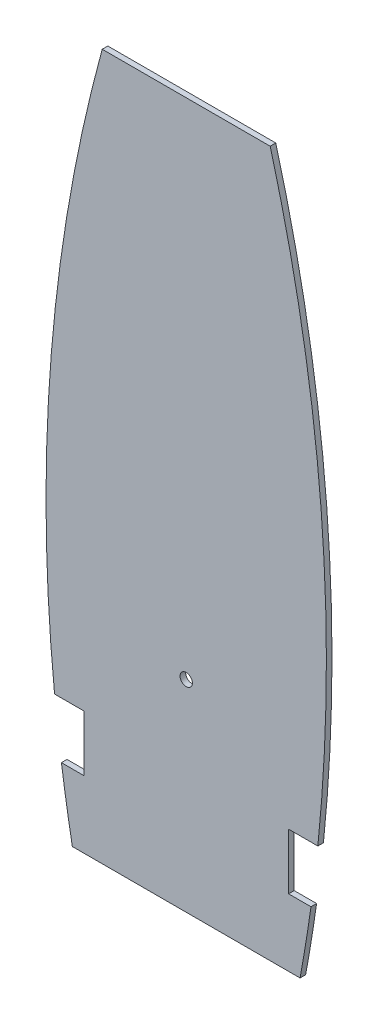
ISO-10303-21;
HEADER;
FILE_DESCRIPTION(('STEP AP214'),'2;1');
FILE_NAME('part.step','',(''),(''),'','','');
FILE_SCHEMA(('AUTOMOTIVE_DESIGN { 1 0 10303 214 1 1 1 1 }'));
ENDSEC;
DATA;
#1=APPLICATION_CONTEXT('core data for automotive mechanical design processes');
#2=APPLICATION_PROTOCOL_DEFINITION('international standard','automotive_design',2000,#1);
#3=PRODUCT_CONTEXT('',#1,'mechanical');
#4=PRODUCT('Part','Part','',(#3));
#5=PRODUCT_RELATED_PRODUCT_CATEGORY('part','',(#4));
#6=PRODUCT_DEFINITION_FORMATION('','',#4);
#7=PRODUCT_DEFINITION_CONTEXT('part definition',#1,'design');
#8=PRODUCT_DEFINITION('design','',#6,#7);
#9=PRODUCT_DEFINITION_SHAPE('','',#8);
#10=(LENGTH_UNIT() NAMED_UNIT(*) SI_UNIT(.MILLI.,.METRE.));
#11=(NAMED_UNIT(*) PLANE_ANGLE_UNIT() SI_UNIT($,.RADIAN.));
#12=(NAMED_UNIT(*) SI_UNIT($,.STERADIAN.) SOLID_ANGLE_UNIT());
#13=UNCERTAINTY_MEASURE_WITH_UNIT(LENGTH_MEASURE(1.E-05),#10,'distance_accuracy_value','');
#14=(GEOMETRIC_REPRESENTATION_CONTEXT(3) GLOBAL_UNCERTAINTY_ASSIGNED_CONTEXT((#13)) GLOBAL_UNIT_ASSIGNED_CONTEXT((#10,
#11,#12)) REPRESENTATION_CONTEXT('',''));
#15=CARTESIAN_POINT('',(0.,0.,0.));
#16=DIRECTION('',(0.,0.,1.));
#17=DIRECTION('',(1.,0.,0.));
#18=AXIS2_PLACEMENT_3D('',#15,#16,#17);
#19=CARTESIAN_POINT('',(-1287.92539340169,-373.27505620024,5.));
#20=DIRECTION('',(0.,0.,-1.));
#21=DIRECTION('',(-1.,0.,0.));
#22=AXIS2_PLACEMENT_3D('',#19,#20,#21);
#23=CYLINDRICAL_SURFACE('',#22,1413.11708487317);
#24=CARTESIAN_POINT('',(-1287.92539340169,-373.27505620024,5.));
#25=DIRECTION('',(0.,0.,1.));
#26=DIRECTION('',(-1.,0.,0.));
#27=AXIS2_PLACEMENT_3D('',#24,#25,#26);
#28=CIRCLE('',#27,1413.11708487317);
#29=CARTESIAN_POINT('',(117.553772728993,-520.,5.));
#30=VERTEX_POINT('',#29);
#31=CARTESIAN_POINT('',(75.,0.,5.));
#32=VERTEX_POINT('',#31);
#33=EDGE_CURVE('E157',#30,#32,#28,.T.);
#34=ORIENTED_EDGE('',*,*,#33,.F.);
#35=DIRECTION('',(0.,0.,-1.));
#36=VECTOR('',#35,1.);
#37=CARTESIAN_POINT('',(117.553772728993,-520.,5.));
#38=LINE('',#37,#36);
#39=CARTESIAN_POINT('',(117.553772728993,-520.,0.));
#40=VERTEX_POINT('',#39);
#41=EDGE_CURVE('E203',#30,#40,#38,.T.);
#42=ORIENTED_EDGE('',*,*,#41,.T.);
#43=CARTESIAN_POINT('',(-1287.92539340169,-373.27505620024,0.));
#44=DIRECTION('',(0.,0.,1.));
#45=DIRECTION('',(-1.,0.,0.));
#46=AXIS2_PLACEMENT_3D('',#43,#44,#45);
#47=CIRCLE('',#46,1413.11708487317);
#48=CARTESIAN_POINT('',(75.,0.,0.));
#49=VERTEX_POINT('',#48);
#50=EDGE_CURVE('E150',#40,#49,#47,.T.);
#51=ORIENTED_EDGE('',*,*,#50,.T.);
#52=DIRECTION('',(0.,0.,-1.));
#53=VECTOR('',#52,1.);
#54=CARTESIAN_POINT('',(75.,0.,5.));
#55=LINE('',#54,#53);
#56=EDGE_CURVE('E11',#32,#49,#55,.T.);
#57=ORIENTED_EDGE('',*,*,#56,.F.);
#58=EDGE_LOOP('',(#34,#42,#51,#57));
#59=FACE_BOUND('',#58,.T.);
#60=ADVANCED_FACE('F32',(#59),#23,.T.);
#61=CARTESIAN_POINT('',(1287.92539340169,-373.27505620024,5.));
#62=DIRECTION('',(0.,0.,-1.));
#63=DIRECTION('',(-1.,0.,0.));
#64=AXIS2_PLACEMENT_3D('',#61,#62,#63);
#65=CYLINDRICAL_SURFACE('',#64,1413.11708487317);
#66=CARTESIAN_POINT('',(1287.92539340169,-373.27505620024,0.));
#67=DIRECTION('',(0.,0.,1.));
#68=DIRECTION('',(1.,0.,0.));
#69=AXIS2_PLACEMENT_3D('',#66,#67,#68);
#70=CIRCLE('',#69,1413.11708487317);
#71=CARTESIAN_POINT('',(-111.431313105777,-570.,0.));
#72=VERTEX_POINT('',#71);
#73=CARTESIAN_POINT('',(-101.676059818425,-630.,0.));
#74=VERTEX_POINT('',#73);
#75=EDGE_CURVE('E156',#72,#74,#70,.T.);
#76=ORIENTED_EDGE('',*,*,#75,.T.);
#77=DIRECTION('',(0.,0.,-1.));
#78=VECTOR('',#77,1.);
#79=CARTESIAN_POINT('',(-101.676059818425,-630.,5.));
#80=LINE('',#79,#78);
#81=CARTESIAN_POINT('',(-101.676059818425,-630.,5.));
#82=VERTEX_POINT('',#81);
#83=EDGE_CURVE('E47',#82,#74,#80,.T.);
#84=ORIENTED_EDGE('',*,*,#83,.F.);
#85=CARTESIAN_POINT('',(1287.92539340169,-373.27505620024,5.));
#86=DIRECTION('',(0.,0.,1.));
#87=DIRECTION('',(1.,0.,0.));
#88=AXIS2_PLACEMENT_3D('',#85,#86,#87);
#89=CIRCLE('',#88,1413.11708487317);
#90=CARTESIAN_POINT('',(-111.431313105777,-570.,5.));
#91=VERTEX_POINT('',#90);
#92=EDGE_CURVE('E145',#91,#82,#89,.T.);
#93=ORIENTED_EDGE('',*,*,#92,.F.);
#94=DIRECTION('',(0.,0.,-1.));
#95=VECTOR('',#94,1.);
#96=CARTESIAN_POINT('',(-111.431313105777,-570.,5.));
#97=LINE('',#96,#95);
#98=EDGE_CURVE('E165',#91,#72,#97,.T.);
#99=ORIENTED_EDGE('',*,*,#98,.T.);
#100=EDGE_LOOP('',(#76,#84,#93,#99));
#101=FACE_BOUND('',#100,.T.);
#102=ADVANCED_FACE('F163',(#101),#65,.T.);
#103=CARTESIAN_POINT('',(101.676059818425,-630.,5.));
#104=VERTEX_POINT('',#103);
#105=CARTESIAN_POINT('',(111.431313105777,-570.,5.));
#106=VERTEX_POINT('',#105);
#107=EDGE_CURVE('E158',#104,#106,#28,.T.);
#108=ORIENTED_EDGE('',*,*,#107,.F.);
#109=DIRECTION('',(0.,0.,-1.));
#110=VECTOR('',#109,1.);
#111=CARTESIAN_POINT('',(101.676059818425,-630.,5.));
#112=LINE('',#111,#110);
#113=CARTESIAN_POINT('',(101.676059818425,-630.,0.));
#114=VERTEX_POINT('',#113);
#115=EDGE_CURVE('E181',#104,#114,#112,.T.);
#116=ORIENTED_EDGE('',*,*,#115,.T.);
#117=CARTESIAN_POINT('',(111.431313105777,-570.,0.));
#118=VERTEX_POINT('',#117);
#119=EDGE_CURVE('E152',#114,#118,#47,.T.);
#120=ORIENTED_EDGE('',*,*,#119,.T.);
#121=DIRECTION('',(0.,0.,-1.));
#122=VECTOR('',#121,1.);
#123=CARTESIAN_POINT('',(111.431313105777,-570.,5.));
#124=LINE('',#123,#122);
#125=EDGE_CURVE('E195',#106,#118,#124,.T.);
#126=ORIENTED_EDGE('',*,*,#125,.F.);
#127=EDGE_LOOP('',(#108,#116,#120,#126));
#128=FACE_BOUND('',#127,.T.);
#129=ADVANCED_FACE('F34',(#128),#23,.T.);
#130=CARTESIAN_POINT('',(-75.,0.,5.));
#131=DIRECTION('',(0.,-1.,0.));
#132=DIRECTION('',(1.,0.,0.));
#133=AXIS2_PLACEMENT_3D('',#130,#131,#132);
#134=PLANE('',#133);
#135=DIRECTION('',(-1.,0.,0.));
#136=VECTOR('',#135,1.);
#137=CARTESIAN_POINT('',(-75.,0.,0.));
#138=LINE('',#137,#136);
#139=CARTESIAN_POINT('',(-75.,0.,0.));
#140=VERTEX_POINT('',#139);
#141=EDGE_CURVE('E154',#49,#140,#138,.T.);
#142=ORIENTED_EDGE('',*,*,#141,.T.);
#143=DIRECTION('',(0.,0.,-1.));
#144=VECTOR('',#143,1.);
#145=CARTESIAN_POINT('',(-75.,0.,5.));
#146=LINE('',#145,#144);
#147=CARTESIAN_POINT('',(-75.,0.,5.));
#148=VERTEX_POINT('',#147);
#149=EDGE_CURVE('E40',#148,#140,#146,.T.);
#150=ORIENTED_EDGE('',*,*,#149,.F.);
#151=DIRECTION('',(-1.,0.,0.));
#152=VECTOR('',#151,1.);
#153=CARTESIAN_POINT('',(-75.,0.,5.));
#154=LINE('',#153,#152);
#155=EDGE_CURVE('E143',#32,#148,#154,.T.);
#156=ORIENTED_EDGE('',*,*,#155,.F.);
#157=ORIENTED_EDGE('',*,*,#56,.T.);
#158=EDGE_LOOP('',(#142,#150,#156,#157));
#159=FACE_BOUND('',#158,.T.);
#160=ADVANCED_FACE('F239',(#159),#134,.F.);
#161=CARTESIAN_POINT('',(-117.553772728993,-520.,0.));
#162=VERTEX_POINT('',#161);
#163=EDGE_CURVE('E137',#140,#162,#70,.T.);
#164=ORIENTED_EDGE('',*,*,#163,.T.);
#165=DIRECTION('',(0.,0.,-1.));
#166=VECTOR('',#165,1.);
#167=CARTESIAN_POINT('',(-117.553772728993,-520.,5.));
#168=LINE('',#167,#166);
#169=CARTESIAN_POINT('',(-117.553772728993,-520.,5.));
#170=VERTEX_POINT('',#169);
#171=EDGE_CURVE('E55',#170,#162,#168,.T.);
#172=ORIENTED_EDGE('',*,*,#171,.F.);
#173=EDGE_CURVE('E135',#148,#170,#89,.T.);
#174=ORIENTED_EDGE('',*,*,#173,.F.);
#175=ORIENTED_EDGE('',*,*,#149,.T.);
#176=EDGE_LOOP('',(#164,#172,#174,#175));
#177=FACE_BOUND('',#176,.T.);
#178=ADVANCED_FACE('F133',(#177),#65,.T.);
#179=CARTESIAN_POINT('',(-1287.92539340169,-373.27505620024,5.));
#180=DIRECTION('',(0.,0.,-1.));
#181=DIRECTION('',(-1.,0.,0.));
#182=AXIS2_PLACEMENT_3D('',#179,#180,#181);
#183=PLANE('',#182);
#184=CARTESIAN_POINT('',(0.,-450.,5.));
#185=DIRECTION('',(0.,0.,-1.));
#186=DIRECTION('',(-1.,0.,0.));
#187=AXIS2_PLACEMENT_3D('',#184,#185,#186);
#188=CIRCLE('',#187,5.5);
#189=CARTESIAN_POINT('',(-5.5,-450.,5.));
#190=VERTEX_POINT('',#189);
#191=EDGE_CURVE('E153',#190,#190,#188,.T.);
#192=ORIENTED_EDGE('',*,*,#191,.T.);
#193=EDGE_LOOP('',(#192));
#194=FACE_BOUND('',#193,.T.);
#195=ORIENTED_EDGE('',*,*,#92,.T.);
#196=DIRECTION('',(1.,0.,0.));
#197=VECTOR('',#196,1.);
#198=CARTESIAN_POINT('',(-101.676059818425,-630.,5.));
#199=LINE('',#198,#197);
#200=EDGE_CURVE('E176',#82,#104,#199,.T.);
#201=ORIENTED_EDGE('',*,*,#200,.T.);
#202=ORIENTED_EDGE('',*,*,#107,.T.);
#203=DIRECTION('',(-1.,0.,0.));
#204=VECTOR('',#203,1.);
#205=CARTESIAN_POINT('',(91.4313131057769,-570.,5.));
#206=LINE('',#205,#204);
#207=CARTESIAN_POINT('',(91.4313131057769,-570.,5.));
#208=VERTEX_POINT('',#207);
#209=EDGE_CURVE('E185',#106,#208,#206,.T.);
#210=ORIENTED_EDGE('',*,*,#209,.T.);
#211=DIRECTION('',(0.,1.,0.));
#212=VECTOR('',#211,1.);
#213=CARTESIAN_POINT('',(91.4313131057769,-520.,5.));
#214=LINE('',#213,#212);
#215=CARTESIAN_POINT('',(91.4313131057769,-520.,5.));
#216=VERTEX_POINT('',#215);
#217=EDGE_CURVE('E188',#208,#216,#214,.T.);
#218=ORIENTED_EDGE('',*,*,#217,.T.);
#219=DIRECTION('',(1.,0.,0.));
#220=VECTOR('',#219,1.);
#221=CARTESIAN_POINT('',(117.553772728993,-520.,5.));
#222=LINE('',#221,#220);
#223=EDGE_CURVE('E192',#216,#30,#222,.T.);
#224=ORIENTED_EDGE('',*,*,#223,.T.);
#225=ORIENTED_EDGE('',*,*,#33,.T.);
#226=ORIENTED_EDGE('',*,*,#155,.T.);
#227=ORIENTED_EDGE('',*,*,#173,.T.);
#228=DIRECTION('',(1.,0.,0.));
#229=VECTOR('',#228,1.);
#230=CARTESIAN_POINT('',(-117.553772728993,-520.,5.));
#231=LINE('',#230,#229);
#232=CARTESIAN_POINT('',(-91.4313131057769,-520.,5.));
#233=VERTEX_POINT('',#232);
#234=EDGE_CURVE('E120',#170,#233,#231,.T.);
#235=ORIENTED_EDGE('',*,*,#234,.T.);
#236=DIRECTION('',(0.,-1.,0.));
#237=VECTOR('',#236,1.);
#238=CARTESIAN_POINT('',(-91.4313131057769,-520.,5.));
#239=LINE('',#238,#237);
#240=CARTESIAN_POINT('',(-91.4313131057769,-570.,5.));
#241=VERTEX_POINT('',#240);
#242=EDGE_CURVE('E127',#233,#241,#239,.T.);
#243=ORIENTED_EDGE('',*,*,#242,.T.);
#244=DIRECTION('',(-1.,0.,0.));
#245=VECTOR('',#244,1.);
#246=CARTESIAN_POINT('',(-91.4313131057769,-570.,5.));
#247=LINE('',#246,#245);
#248=EDGE_CURVE('E138',#241,#91,#247,.T.);
#249=ORIENTED_EDGE('',*,*,#248,.T.);
#250=EDGE_LOOP('',(#195,#201,#202,#210,#218,#224,#225,#226,#227,#235,#243,#249));
#251=FACE_BOUND('',#250,.T.);
#252=ADVANCED_FACE('F141',(#194,#251),#183,.F.);
#253=CARTESIAN_POINT('',(-1287.92539340169,-373.27505620024,0.));
#254=DIRECTION('',(0.,0.,-1.));
#255=DIRECTION('',(-1.,0.,0.));
#256=AXIS2_PLACEMENT_3D('',#253,#254,#255);
#257=PLANE('',#256);
#258=DIRECTION('',(1.,0.,0.));
#259=VECTOR('',#258,1.);
#260=CARTESIAN_POINT('',(-101.676059818425,-630.,0.));
#261=LINE('',#260,#259);
#262=EDGE_CURVE('E172',#74,#114,#261,.T.);
#263=ORIENTED_EDGE('',*,*,#262,.F.);
#264=ORIENTED_EDGE('',*,*,#75,.F.);
#265=DIRECTION('',(-1.,0.,0.));
#266=VECTOR('',#265,1.);
#267=CARTESIAN_POINT('',(-91.4313131057769,-570.,0.));
#268=LINE('',#267,#266);
#269=CARTESIAN_POINT('',(-91.4313131057769,-570.,0.));
#270=VERTEX_POINT('',#269);
#271=EDGE_CURVE('E128',#270,#72,#268,.T.);
#272=ORIENTED_EDGE('',*,*,#271,.F.);
#273=DIRECTION('',(0.,-1.,0.));
#274=VECTOR('',#273,1.);
#275=CARTESIAN_POINT('',(-91.4313131057769,-520.,0.));
#276=LINE('',#275,#274);
#277=CARTESIAN_POINT('',(-91.4313131057769,-520.,0.));
#278=VERTEX_POINT('',#277);
#279=EDGE_CURVE('E284',#278,#270,#276,.T.);
#280=ORIENTED_EDGE('',*,*,#279,.F.);
#281=DIRECTION('',(1.,0.,0.));
#282=VECTOR('',#281,1.);
#283=CARTESIAN_POINT('',(-117.553772728993,-520.,0.));
#284=LINE('',#283,#282);
#285=EDGE_CURVE('E183',#162,#278,#284,.T.);
#286=ORIENTED_EDGE('',*,*,#285,.F.);
#287=ORIENTED_EDGE('',*,*,#163,.F.);
#288=ORIENTED_EDGE('',*,*,#141,.F.);
#289=ORIENTED_EDGE('',*,*,#50,.F.);
#290=DIRECTION('',(1.,0.,0.));
#291=VECTOR('',#290,1.);
#292=CARTESIAN_POINT('',(117.553772728993,-520.,0.));
#293=LINE('',#292,#291);
#294=CARTESIAN_POINT('',(91.4313131057769,-520.,0.));
#295=VERTEX_POINT('',#294);
#296=EDGE_CURVE('E189',#295,#40,#293,.T.);
#297=ORIENTED_EDGE('',*,*,#296,.F.);
#298=DIRECTION('',(0.,1.,0.));
#299=VECTOR('',#298,1.);
#300=CARTESIAN_POINT('',(91.4313131057769,-520.,0.));
#301=LINE('',#300,#299);
#302=CARTESIAN_POINT('',(91.4313131057769,-570.,0.));
#303=VERTEX_POINT('',#302);
#304=EDGE_CURVE('E199',#303,#295,#301,.T.);
#305=ORIENTED_EDGE('',*,*,#304,.F.);
#306=DIRECTION('',(-1.,0.,0.));
#307=VECTOR('',#306,1.);
#308=CARTESIAN_POINT('',(91.4313131057769,-570.,0.));
#309=LINE('',#308,#307);
#310=EDGE_CURVE('E196',#118,#303,#309,.T.);
#311=ORIENTED_EDGE('',*,*,#310,.F.);
#312=ORIENTED_EDGE('',*,*,#119,.F.);
#313=EDGE_LOOP('',(#263,#264,#272,#280,#286,#287,#288,#289,#297,#305,#311,#312));
#314=FACE_BOUND('',#313,.T.);
#315=CARTESIAN_POINT('',(0.,-450.,0.));
#316=DIRECTION('',(0.,0.,-1.));
#317=DIRECTION('',(-1.,0.,0.));
#318=AXIS2_PLACEMENT_3D('',#315,#316,#317);
#319=CIRCLE('',#318,5.5);
#320=CARTESIAN_POINT('',(-5.5,-450.,0.));
#321=VERTEX_POINT('',#320);
#322=EDGE_CURVE('E206',#321,#321,#319,.T.);
#323=ORIENTED_EDGE('',*,*,#322,.F.);
#324=EDGE_LOOP('',(#323));
#325=FACE_BOUND('',#324,.T.);
#326=ADVANCED_FACE('F168',(#314,#325),#257,.T.);
#327=CARTESIAN_POINT('',(0.,-450.,5.));
#328=DIRECTION('',(0.,0.,-1.));
#329=DIRECTION('',(-1.,0.,0.));
#330=AXIS2_PLACEMENT_3D('',#327,#328,#329);
#331=CYLINDRICAL_SURFACE('',#330,5.5);
#332=ORIENTED_EDGE('',*,*,#191,.F.);
#333=EDGE_LOOP('',(#332));
#334=FACE_BOUND('',#333,.T.);
#335=ORIENTED_EDGE('',*,*,#322,.T.);
#336=EDGE_LOOP('',(#335));
#337=FACE_BOUND('',#336,.T.);
#338=ADVANCED_FACE('F217',(#334,#337),#331,.F.);
#339=CARTESIAN_POINT('',(117.553772728993,-520.,5.));
#340=DIRECTION('',(0.,1.,0.));
#341=DIRECTION('',(-1.,0.,0.));
#342=AXIS2_PLACEMENT_3D('',#339,#340,#341);
#343=PLANE('',#342);
#344=ORIENTED_EDGE('',*,*,#296,.T.);
#345=ORIENTED_EDGE('',*,*,#41,.F.);
#346=ORIENTED_EDGE('',*,*,#223,.F.);
#347=DIRECTION('',(0.,0.,-1.));
#348=VECTOR('',#347,1.);
#349=CARTESIAN_POINT('',(91.4313131057769,-520.,5.));
#350=LINE('',#349,#348);
#351=EDGE_CURVE('E207',#216,#295,#350,.T.);
#352=ORIENTED_EDGE('',*,*,#351,.T.);
#353=EDGE_LOOP('',(#344,#345,#346,#352));
#354=FACE_BOUND('',#353,.T.);
#355=ADVANCED_FACE('F225',(#354),#343,.F.);
#356=CARTESIAN_POINT('',(91.4313131057769,-520.,5.));
#357=DIRECTION('',(-1.,0.,0.));
#358=DIRECTION('',(0.,0.,1.));
#359=AXIS2_PLACEMENT_3D('',#356,#357,#358);
#360=PLANE('',#359);
#361=ORIENTED_EDGE('',*,*,#304,.T.);
#362=ORIENTED_EDGE('',*,*,#351,.F.);
#363=ORIENTED_EDGE('',*,*,#217,.F.);
#364=DIRECTION('',(0.,0.,-1.));
#365=VECTOR('',#364,1.);
#366=CARTESIAN_POINT('',(91.4313131057769,-570.,5.));
#367=LINE('',#366,#365);
#368=EDGE_CURVE('E209',#208,#303,#367,.T.);
#369=ORIENTED_EDGE('',*,*,#368,.T.);
#370=EDGE_LOOP('',(#361,#362,#363,#369));
#371=FACE_BOUND('',#370,.T.);
#372=ADVANCED_FACE('F262',(#371),#360,.F.);
#373=CARTESIAN_POINT('',(91.4313131057769,-570.,5.));
#374=DIRECTION('',(0.,-1.,0.));
#375=DIRECTION('',(0.,0.,-1.));
#376=AXIS2_PLACEMENT_3D('',#373,#374,#375);
#377=PLANE('',#376);
#378=ORIENTED_EDGE('',*,*,#310,.T.);
#379=ORIENTED_EDGE('',*,*,#368,.F.);
#380=ORIENTED_EDGE('',*,*,#209,.F.);
#381=ORIENTED_EDGE('',*,*,#125,.T.);
#382=EDGE_LOOP('',(#378,#379,#380,#381));
#383=FACE_BOUND('',#382,.T.);
#384=ADVANCED_FACE('F266',(#383),#377,.F.);
#385=CARTESIAN_POINT('',(-91.4313131057769,-570.,5.));
#386=DIRECTION('',(0.,-1.,0.));
#387=DIRECTION('',(0.,0.,-1.));
#388=AXIS2_PLACEMENT_3D('',#385,#386,#387);
#389=PLANE('',#388);
#390=ORIENTED_EDGE('',*,*,#271,.T.);
#391=ORIENTED_EDGE('',*,*,#98,.F.);
#392=ORIENTED_EDGE('',*,*,#248,.F.);
#393=DIRECTION('',(0.,0.,-1.));
#394=VECTOR('',#393,1.);
#395=CARTESIAN_POINT('',(-91.4313131057769,-570.,5.));
#396=LINE('',#395,#394);
#397=EDGE_CURVE('E292',#241,#270,#396,.T.);
#398=ORIENTED_EDGE('',*,*,#397,.T.);
#399=EDGE_LOOP('',(#390,#391,#392,#398));
#400=FACE_BOUND('',#399,.T.);
#401=ADVANCED_FACE('F269',(#400),#389,.F.);
#402=CARTESIAN_POINT('',(-91.4313131057769,-520.,5.));
#403=DIRECTION('',(1.,0.,0.));
#404=DIRECTION('',(0.,0.,-1.));
#405=AXIS2_PLACEMENT_3D('',#402,#403,#404);
#406=PLANE('',#405);
#407=ORIENTED_EDGE('',*,*,#279,.T.);
#408=ORIENTED_EDGE('',*,*,#397,.F.);
#409=ORIENTED_EDGE('',*,*,#242,.F.);
#410=DIRECTION('',(0.,0.,-1.));
#411=VECTOR('',#410,1.);
#412=CARTESIAN_POINT('',(-91.4313131057769,-520.,5.));
#413=LINE('',#412,#411);
#414=EDGE_CURVE('E122',#233,#278,#413,.T.);
#415=ORIENTED_EDGE('',*,*,#414,.T.);
#416=EDGE_LOOP('',(#407,#408,#409,#415));
#417=FACE_BOUND('',#416,.T.);
#418=ADVANCED_FACE('F256',(#417),#406,.F.);
#419=CARTESIAN_POINT('',(-117.553772728993,-520.,5.));
#420=DIRECTION('',(0.,1.,0.));
#421=DIRECTION('',(-1.,0.,0.));
#422=AXIS2_PLACEMENT_3D('',#419,#420,#421);
#423=PLANE('',#422);
#424=ORIENTED_EDGE('',*,*,#285,.T.);
#425=ORIENTED_EDGE('',*,*,#414,.F.);
#426=ORIENTED_EDGE('',*,*,#234,.F.);
#427=ORIENTED_EDGE('',*,*,#171,.T.);
#428=EDGE_LOOP('',(#424,#425,#426,#427));
#429=FACE_BOUND('',#428,.T.);
#430=ADVANCED_FACE('F121',(#429),#423,.F.);
#431=CARTESIAN_POINT('',(-101.676059818425,-630.,5.));
#432=DIRECTION('',(0.,1.,0.));
#433=DIRECTION('',(-1.,0.,0.));
#434=AXIS2_PLACEMENT_3D('',#431,#432,#433);
#435=PLANE('',#434);
#436=ORIENTED_EDGE('',*,*,#262,.T.);
#437=ORIENTED_EDGE('',*,*,#115,.F.);
#438=ORIENTED_EDGE('',*,*,#200,.F.);
#439=ORIENTED_EDGE('',*,*,#83,.T.);
#440=EDGE_LOOP('',(#436,#437,#438,#439));
#441=FACE_BOUND('',#440,.T.);
#442=ADVANCED_FACE('F250',(#441),#435,.F.);
#443=CLOSED_SHELL('',(#60,#102,#129,#160,#178,#252,#326,#338,#355,#372,#384,#401,#418,#430,#442));
#444=MANIFOLD_SOLID_BREP('B2',#443);
#445=ADVANCED_BREP_SHAPE_REPRESENTATION('',(#18,#444),#14);
#446=SHAPE_DEFINITION_REPRESENTATION(#9,#445);
ENDSEC;
END-ISO-10303-21;
